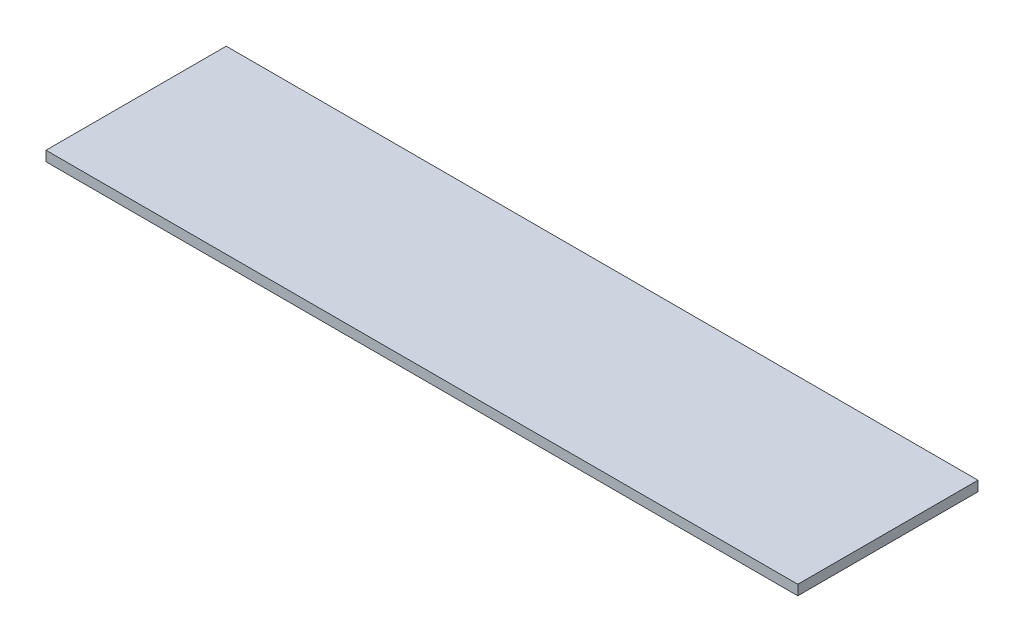
ISO-10303-21;
HEADER;
FILE_DESCRIPTION(('STEP AP214'),'2;1');
FILE_NAME('part.step','',(''),(''),'','','');
FILE_SCHEMA(('AUTOMOTIVE_DESIGN { 1 0 10303 214 1 1 1 1 }'));
ENDSEC;
DATA;
#1=APPLICATION_CONTEXT('core data for automotive mechanical design processes');
#2=APPLICATION_PROTOCOL_DEFINITION('international standard','automotive_design',2000,#1);
#3=PRODUCT_CONTEXT('',#1,'mechanical');
#4=PRODUCT('Part','Part','',(#3));
#5=PRODUCT_RELATED_PRODUCT_CATEGORY('part','',(#4));
#6=PRODUCT_DEFINITION_FORMATION('','',#4);
#7=PRODUCT_DEFINITION_CONTEXT('part definition',#1,'design');
#8=PRODUCT_DEFINITION('design','',#6,#7);
#9=PRODUCT_DEFINITION_SHAPE('','',#8);
#10=(LENGTH_UNIT() NAMED_UNIT(*) SI_UNIT(.MILLI.,.METRE.));
#11=(NAMED_UNIT(*) PLANE_ANGLE_UNIT() SI_UNIT($,.RADIAN.));
#12=(NAMED_UNIT(*) SI_UNIT($,.STERADIAN.) SOLID_ANGLE_UNIT());
#13=UNCERTAINTY_MEASURE_WITH_UNIT(LENGTH_MEASURE(1.E-05),#10,'distance_accuracy_value','');
#14=(GEOMETRIC_REPRESENTATION_CONTEXT(3) GLOBAL_UNCERTAINTY_ASSIGNED_CONTEXT((#13)) GLOBAL_UNIT_ASSIGNED_CONTEXT((#10,
#11,#12)) REPRESENTATION_CONTEXT('',''));
#15=CARTESIAN_POINT('',(0.,0.,0.));
#16=DIRECTION('',(0.,0.,1.));
#17=DIRECTION('',(1.,0.,0.));
#18=AXIS2_PLACEMENT_3D('',#15,#16,#17);
#19=CARTESIAN_POINT('',(-159.187756998213,1.57979560504202,-40.8122430017871));
#20=DIRECTION('',(-1.,0.,0.));
#21=DIRECTION('',(0.,0.,1.));
#22=AXIS2_PLACEMENT_3D('',#19,#20,#21);
#23=PLANE('',#22);
#24=DIRECTION('',(0.,0.,-1.));
#25=VECTOR('',#24,1.);
#26=CARTESIAN_POINT('',(-159.187756998213,0.001,-40.8122430017871));
#27=LINE('',#26,#25);
#28=CARTESIAN_POINT('',(-159.187756998213,0.001,-40.8122430017871));
#29=VERTEX_POINT('',#28);
#30=CARTESIAN_POINT('',(-159.187756998213,0.001,-69.1877569982129));
#31=VERTEX_POINT('',#30);
#32=EDGE_CURVE('E79',#29,#31,#27,.T.);
#33=ORIENTED_EDGE('',*,*,#32,.F.);
#34=DIRECTION('',(0.,-1.,0.));
#35=VECTOR('',#34,1.);
#36=CARTESIAN_POINT('',(-159.187756998213,1.57979560504202,-40.8122430017871));
#37=LINE('',#36,#35);
#38=CARTESIAN_POINT('',(-159.187756998213,1.57979560504202,-40.8122430017871));
#39=VERTEX_POINT('',#38);
#40=EDGE_CURVE('E32',#39,#29,#37,.T.);
#41=ORIENTED_EDGE('',*,*,#40,.F.);
#42=DIRECTION('',(0.,0.,-1.));
#43=VECTOR('',#42,1.);
#44=CARTESIAN_POINT('',(-159.187756998213,1.57979560504202,-40.8122430017871));
#45=LINE('',#44,#43);
#46=CARTESIAN_POINT('',(-159.187756998213,1.57979560504202,-69.1877569982129));
#47=VERTEX_POINT('',#46);
#48=EDGE_CURVE('E71',#39,#47,#45,.T.);
#49=ORIENTED_EDGE('',*,*,#48,.T.);
#50=DIRECTION('',(0.,-1.,0.));
#51=VECTOR('',#50,1.);
#52=CARTESIAN_POINT('',(-159.187756998213,1.57979560504202,-69.1877569982129));
#53=LINE('',#52,#51);
#54=EDGE_CURVE('E10',#47,#31,#53,.T.);
#55=ORIENTED_EDGE('',*,*,#54,.T.);
#56=EDGE_LOOP('',(#33,#41,#49,#55));
#57=FACE_BOUND('',#56,.T.);
#58=ADVANCED_FACE('F16',(#57),#23,.T.);
#59=CARTESIAN_POINT('',(-159.187756998213,1.57979560504202,-69.1877569982129));
#60=DIRECTION('',(0.,0.,-1.));
#61=DIRECTION('',(-1.,0.,0.));
#62=AXIS2_PLACEMENT_3D('',#59,#60,#61);
#63=PLANE('',#62);
#64=DIRECTION('',(1.,0.,0.));
#65=VECTOR('',#64,1.);
#66=CARTESIAN_POINT('',(-159.187756998213,0.001,-69.1877569982129));
#67=LINE('',#66,#65);
#68=CARTESIAN_POINT('',(-40.8122430017871,0.001,-69.1877569982129));
#69=VERTEX_POINT('',#68);
#70=EDGE_CURVE('E82',#31,#69,#67,.T.);
#71=ORIENTED_EDGE('',*,*,#70,.F.);
#72=ORIENTED_EDGE('',*,*,#54,.F.);
#73=DIRECTION('',(1.,0.,0.));
#74=VECTOR('',#73,1.);
#75=CARTESIAN_POINT('',(-159.187756998213,1.57979560504202,-69.1877569982129));
#76=LINE('',#75,#74);
#77=CARTESIAN_POINT('',(-40.8122430017871,1.57979560504202,-69.1877569982129));
#78=VERTEX_POINT('',#77);
#79=EDGE_CURVE('E67',#47,#78,#76,.T.);
#80=ORIENTED_EDGE('',*,*,#79,.T.);
#81=DIRECTION('',(0.,-1.,0.));
#82=VECTOR('',#81,1.);
#83=CARTESIAN_POINT('',(-40.8122430017871,1.57979560504202,-69.1877569982129));
#84=LINE('',#83,#82);
#85=EDGE_CURVE('E24',#78,#69,#84,.T.);
#86=ORIENTED_EDGE('',*,*,#85,.T.);
#87=EDGE_LOOP('',(#71,#72,#80,#86));
#88=FACE_BOUND('',#87,.T.);
#89=ADVANCED_FACE('F68',(#88),#63,.T.);
#90=CARTESIAN_POINT('',(-40.8122430017871,1.57979560504202,-69.1877569982129));
#91=DIRECTION('',(1.,0.,0.));
#92=DIRECTION('',(0.,0.,-1.));
#93=AXIS2_PLACEMENT_3D('',#90,#91,#92);
#94=PLANE('',#93);
#95=DIRECTION('',(0.,0.,1.));
#96=VECTOR('',#95,1.);
#97=CARTESIAN_POINT('',(-40.8122430017871,0.001,-69.1877569982129));
#98=LINE('',#97,#96);
#99=CARTESIAN_POINT('',(-40.8122430017871,0.001,-40.8122430017871));
#100=VERTEX_POINT('',#99);
#101=EDGE_CURVE('E65',#69,#100,#98,.T.);
#102=ORIENTED_EDGE('',*,*,#101,.F.);
#103=ORIENTED_EDGE('',*,*,#85,.F.);
#104=DIRECTION('',(0.,0.,1.));
#105=VECTOR('',#104,1.);
#106=CARTESIAN_POINT('',(-40.8122430017871,1.57979560504202,-69.1877569982129));
#107=LINE('',#106,#105);
#108=CARTESIAN_POINT('',(-40.8122430017871,1.57979560504202,-40.8122430017871));
#109=VERTEX_POINT('',#108);
#110=EDGE_CURVE('E62',#78,#109,#107,.T.);
#111=ORIENTED_EDGE('',*,*,#110,.T.);
#112=DIRECTION('',(0.,-1.,0.));
#113=VECTOR('',#112,1.);
#114=CARTESIAN_POINT('',(-40.8122430017871,1.57979560504202,-40.8122430017871));
#115=LINE('',#114,#113);
#116=EDGE_CURVE('E48',#109,#100,#115,.T.);
#117=ORIENTED_EDGE('',*,*,#116,.T.);
#118=EDGE_LOOP('',(#102,#103,#111,#117));
#119=FACE_BOUND('',#118,.T.);
#120=ADVANCED_FACE('F60',(#119),#94,.T.);
#121=CARTESIAN_POINT('',(-40.8122430017871,1.57979560504202,-40.8122430017871));
#122=DIRECTION('',(0.,0.,1.));
#123=DIRECTION('',(1.,0.,0.));
#124=AXIS2_PLACEMENT_3D('',#121,#122,#123);
#125=PLANE('',#124);
#126=DIRECTION('',(-1.,0.,0.));
#127=VECTOR('',#126,1.);
#128=CARTESIAN_POINT('',(-40.8122430017871,0.001,-40.8122430017871));
#129=LINE('',#128,#127);
#130=EDGE_CURVE('E85',#100,#29,#129,.T.);
#131=ORIENTED_EDGE('',*,*,#130,.F.);
#132=ORIENTED_EDGE('',*,*,#116,.F.);
#133=DIRECTION('',(-1.,0.,0.));
#134=VECTOR('',#133,1.);
#135=CARTESIAN_POINT('',(-40.8122430017871,1.57979560504202,-40.8122430017871));
#136=LINE('',#135,#134);
#137=EDGE_CURVE('E74',#109,#39,#136,.T.);
#138=ORIENTED_EDGE('',*,*,#137,.T.);
#139=ORIENTED_EDGE('',*,*,#40,.T.);
#140=EDGE_LOOP('',(#131,#132,#138,#139));
#141=FACE_BOUND('',#140,.T.);
#142=ADVANCED_FACE('F96',(#141),#125,.T.);
#143=CARTESIAN_POINT('',(-100.,1.57979560504202,-42.));
#144=DIRECTION('',(0.,-1.,0.));
#145=DIRECTION('',(1.,0.,0.));
#146=AXIS2_PLACEMENT_3D('',#143,#144,#145);
#147=PLANE('',#146);
#148=ORIENTED_EDGE('',*,*,#48,.F.);
#149=ORIENTED_EDGE('',*,*,#137,.F.);
#150=ORIENTED_EDGE('',*,*,#110,.F.);
#151=ORIENTED_EDGE('',*,*,#79,.F.);
#152=EDGE_LOOP('',(#148,#149,#150,#151));
#153=FACE_BOUND('',#152,.T.);
#154=ADVANCED_FACE('F73',(#153),#147,.F.);
#155=CARTESIAN_POINT('',(-100.,0.001,-42.));
#156=DIRECTION('',(0.,-1.,0.));
#157=DIRECTION('',(1.,0.,0.));
#158=AXIS2_PLACEMENT_3D('',#155,#156,#157);
#159=PLANE('',#158);
#160=ORIENTED_EDGE('',*,*,#32,.T.);
#161=ORIENTED_EDGE('',*,*,#70,.T.);
#162=ORIENTED_EDGE('',*,*,#101,.T.);
#163=ORIENTED_EDGE('',*,*,#130,.T.);
#164=EDGE_LOOP('',(#160,#161,#162,#163));
#165=FACE_BOUND('',#164,.T.);
#166=ADVANCED_FACE('F89',(#165),#159,.T.);
#167=CLOSED_SHELL('',(#58,#89,#120,#142,#154,#166));
#168=MANIFOLD_SOLID_BREP('B1',#167);
#169=ADVANCED_BREP_SHAPE_REPRESENTATION('',(#18,#168),#14);
#170=SHAPE_DEFINITION_REPRESENTATION(#9,#169);
ENDSEC;
END-ISO-10303-21;
